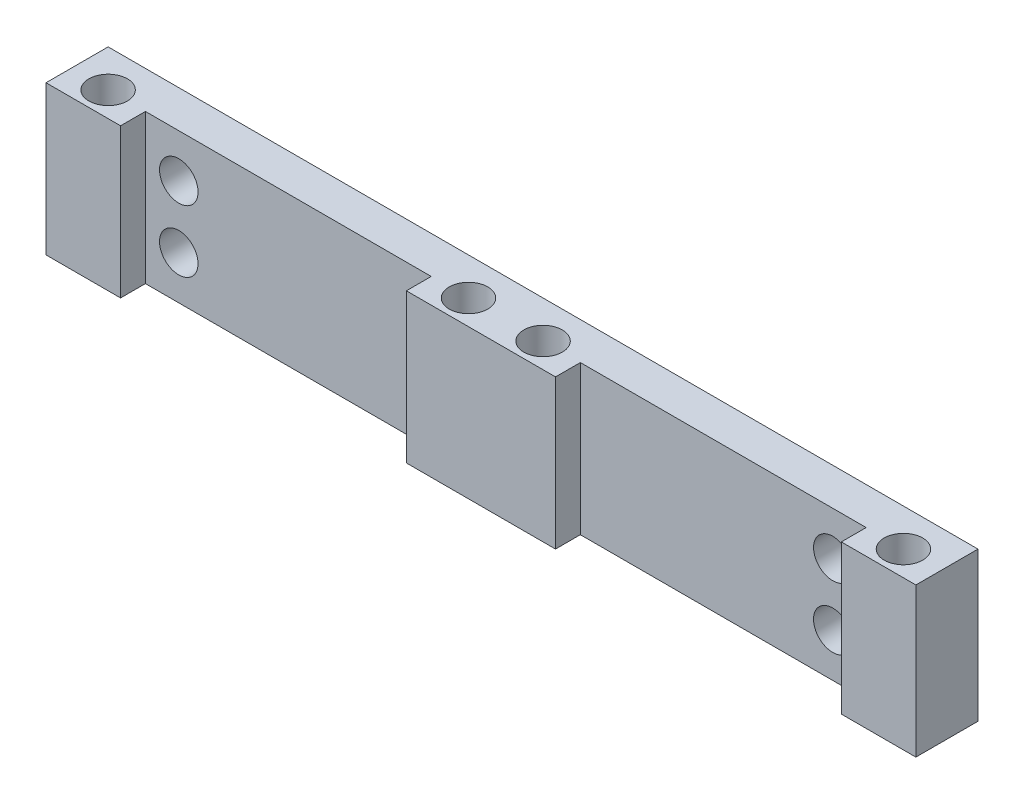
ISO-10303-21;
HEADER;
FILE_DESCRIPTION(('STEP AP214'),'2;1');
FILE_NAME('part.step','',(''),(''),'','','');
FILE_SCHEMA(('AUTOMOTIVE_DESIGN { 1 0 10303 214 1 1 1 1 }'));
ENDSEC;
DATA;
#1=APPLICATION_CONTEXT('core data for automotive mechanical design processes');
#2=APPLICATION_PROTOCOL_DEFINITION('international standard','automotive_design',2000,#1);
#3=PRODUCT_CONTEXT('',#1,'mechanical');
#4=PRODUCT('Part','Part','',(#3));
#5=PRODUCT_RELATED_PRODUCT_CATEGORY('part','',(#4));
#6=PRODUCT_DEFINITION_FORMATION('','',#4);
#7=PRODUCT_DEFINITION_CONTEXT('part definition',#1,'design');
#8=PRODUCT_DEFINITION('design','',#6,#7);
#9=PRODUCT_DEFINITION_SHAPE('','',#8);
#10=(LENGTH_UNIT() NAMED_UNIT(*) SI_UNIT(.MILLI.,.METRE.));
#11=(NAMED_UNIT(*) PLANE_ANGLE_UNIT() SI_UNIT($,.RADIAN.));
#12=(NAMED_UNIT(*) SI_UNIT($,.STERADIAN.) SOLID_ANGLE_UNIT());
#13=UNCERTAINTY_MEASURE_WITH_UNIT(LENGTH_MEASURE(1.E-05),#10,'distance_accuracy_value','');
#14=(GEOMETRIC_REPRESENTATION_CONTEXT(3) GLOBAL_UNCERTAINTY_ASSIGNED_CONTEXT((#13)) GLOBAL_UNIT_ASSIGNED_CONTEXT((#10,
#11,#12)) REPRESENTATION_CONTEXT('',''));
#15=CARTESIAN_POINT('',(0.,0.,0.));
#16=DIRECTION('',(0.,0.,1.));
#17=DIRECTION('',(1.,0.,0.));
#18=AXIS2_PLACEMENT_3D('',#15,#16,#17);
#19=CARTESIAN_POINT('',(0.,0.,0.));
#20=DIRECTION('',(0.,0.,1.));
#21=DIRECTION('',(1.,0.,0.));
#22=AXIS2_PLACEMENT_3D('',#19,#20,#21);
#23=PLANE('',#22);
#24=DIRECTION('',(0.,1.,0.));
#25=VECTOR('',#24,1.);
#26=CARTESIAN_POINT('',(44.,-6.,0.));
#27=LINE('',#26,#25);
#28=CARTESIAN_POINT('',(44.,-6.,0.));
#29=VERTEX_POINT('',#28);
#30=CARTESIAN_POINT('',(44.,6.,0.));
#31=VERTEX_POINT('',#30);
#32=EDGE_CURVE('E331',#29,#31,#27,.T.);
#33=ORIENTED_EDGE('',*,*,#32,.F.);
#34=DIRECTION('',(1.,0.,0.));
#35=VECTOR('',#34,1.);
#36=CARTESIAN_POINT('',(50.,-5.99999999999999,0.));
#37=LINE('',#36,#35);
#38=CARTESIAN_POINT('',(56.,-6.,0.));
#39=VERTEX_POINT('',#38);
#40=EDGE_CURVE('E346',#29,#39,#37,.T.);
#41=ORIENTED_EDGE('',*,*,#40,.T.);
#42=DIRECTION('',(0.,1.,0.));
#43=VECTOR('',#42,1.);
#44=CARTESIAN_POINT('',(56.,-6.,0.));
#45=LINE('',#44,#43);
#46=CARTESIAN_POINT('',(56.,6.,0.));
#47=VERTEX_POINT('',#46);
#48=EDGE_CURVE('E314',#39,#47,#45,.T.);
#49=ORIENTED_EDGE('',*,*,#48,.T.);
#50=DIRECTION('',(-1.,0.,0.));
#51=VECTOR('',#50,1.);
#52=CARTESIAN_POINT('',(50.,6.00000000000001,0.));
#53=LINE('',#52,#51);
#54=EDGE_CURVE('E280',#47,#31,#53,.T.);
#55=ORIENTED_EDGE('',*,*,#54,.T.);
#56=EDGE_LOOP('',(#33,#41,#49,#55));
#57=FACE_BOUND('',#56,.T.);
#58=ADVANCED_FACE('F163',(#57),#23,.T.);
#59=CARTESIAN_POINT('',(15.,0.,0.));
#60=DIRECTION('',(1.,0.,0.));
#61=DIRECTION('',(0.,0.,-1.));
#62=AXIS2_PLACEMENT_3D('',#59,#60,#61);
#63=PLANE('',#62);
#64=DIRECTION('',(0.,-1.,0.));
#65=VECTOR('',#64,1.);
#66=CARTESIAN_POINT('',(15.,2.99982278406222,0.));
#67=LINE('',#66,#65);
#68=CARTESIAN_POINT('',(15.,6.,0.));
#69=VERTEX_POINT('',#68);
#70=CARTESIAN_POINT('',(15.,-6.,0.));
#71=VERTEX_POINT('',#70);
#72=EDGE_CURVE('E336',#69,#71,#67,.T.);
#73=ORIENTED_EDGE('',*,*,#72,.F.);
#74=DIRECTION('',(0.,0.,1.));
#75=VECTOR('',#74,1.);
#76=CARTESIAN_POINT('',(15.,5.99999999999999,-10.));
#77=LINE('',#76,#75);
#78=CARTESIAN_POINT('',(15.,5.99999999999999,-5.));
#79=VERTEX_POINT('',#78);
#80=EDGE_CURVE('E188',#79,#69,#77,.T.);
#81=ORIENTED_EDGE('',*,*,#80,.F.);
#82=DIRECTION('',(0.,1.,0.));
#83=VECTOR('',#82,1.);
#84=CARTESIAN_POINT('',(15.,0.,-5.));
#85=LINE('',#84,#83);
#86=CARTESIAN_POINT('',(15.,-6.,-5.));
#87=VERTEX_POINT('',#86);
#88=EDGE_CURVE('E12',#87,#79,#85,.T.);
#89=ORIENTED_EDGE('',*,*,#88,.F.);
#90=DIRECTION('',(0.,0.,1.));
#91=VECTOR('',#90,1.);
#92=CARTESIAN_POINT('',(15.,-6.,-10.));
#93=LINE('',#92,#91);
#94=EDGE_CURVE('E344',#87,#71,#93,.T.);
#95=ORIENTED_EDGE('',*,*,#94,.T.);
#96=EDGE_LOOP('',(#73,#81,#89,#95));
#97=FACE_BOUND('',#96,.T.);
#98=ADVANCED_FACE('F420',(#97),#63,.F.);
#99=DIRECTION('',(0.,-1.,0.));
#100=VECTOR('',#99,1.);
#101=CARTESIAN_POINT('',(21.,-6.,0.));
#102=LINE('',#101,#100);
#103=CARTESIAN_POINT('',(21.,6.,0.));
#104=VERTEX_POINT('',#103);
#105=CARTESIAN_POINT('',(21.,-6.,0.));
#106=VERTEX_POINT('',#105);
#107=EDGE_CURVE('E325',#104,#106,#102,.T.);
#108=ORIENTED_EDGE('',*,*,#107,.F.);
#109=EDGE_CURVE('E356',#104,#69,#53,.T.);
#110=ORIENTED_EDGE('',*,*,#109,.T.);
#111=ORIENTED_EDGE('',*,*,#72,.T.);
#112=EDGE_CURVE('E353',#71,#106,#37,.T.);
#113=ORIENTED_EDGE('',*,*,#112,.T.);
#114=EDGE_LOOP('',(#108,#110,#111,#113));
#115=FACE_BOUND('',#114,.T.);
#116=ADVANCED_FACE('F419',(#115),#23,.T.);
#117=CARTESIAN_POINT('',(50.,6.00000000000001,-5.));
#118=DIRECTION('',(0.,1.,0.));
#119=DIRECTION('',(-1.,0.,0.));
#120=AXIS2_PLACEMENT_3D('',#117,#118,#119);
#121=PLANE('',#120);
#122=CARTESIAN_POINT('',(18.,6.,-2.));
#123=DIRECTION('',(0.,1.,0.));
#124=DIRECTION('',(-1.,0.,0.));
#125=AXIS2_PLACEMENT_3D('',#122,#123,#124);
#126=CIRCLE('',#125,1.55);
#127=CARTESIAN_POINT('',(16.45,6.,-2.));
#128=VERTEX_POINT('',#127);
#129=EDGE_CURVE('E315',#128,#128,#126,.T.);
#130=ORIENTED_EDGE('',*,*,#129,.F.);
#131=EDGE_LOOP('',(#130));
#132=FACE_BOUND('',#131,.T.);
#133=CARTESIAN_POINT('',(47.,6.00000000000001,-2.));
#134=DIRECTION('',(0.,1.,0.));
#135=DIRECTION('',(-1.,0.,0.));
#136=AXIS2_PLACEMENT_3D('',#133,#134,#135);
#137=CIRCLE('',#136,1.55);
#138=CARTESIAN_POINT('',(45.45,6.00000000000001,-2.));
#139=VERTEX_POINT('',#138);
#140=EDGE_CURVE('E306',#139,#139,#137,.T.);
#141=ORIENTED_EDGE('',*,*,#140,.F.);
#142=EDGE_LOOP('',(#141));
#143=FACE_BOUND('',#142,.T.);
#144=DIRECTION('',(0.,0.,1.));
#145=VECTOR('',#144,1.);
#146=CARTESIAN_POINT('',(44.,6.,-2.));
#147=LINE('',#146,#145);
#148=CARTESIAN_POINT('',(44.,6.,-2.));
#149=VERTEX_POINT('',#148);
#150=EDGE_CURVE('E330',#149,#31,#147,.T.);
#151=ORIENTED_EDGE('',*,*,#150,.T.);
#152=ORIENTED_EDGE('',*,*,#54,.F.);
#153=DIRECTION('',(0.,0.,1.));
#154=VECTOR('',#153,1.);
#155=CARTESIAN_POINT('',(56.,6.,-2.));
#156=LINE('',#155,#154);
#157=CARTESIAN_POINT('',(56.,6.,-2.));
#158=VERTEX_POINT('',#157);
#159=EDGE_CURVE('E260',#158,#47,#156,.T.);
#160=ORIENTED_EDGE('',*,*,#159,.F.);
#161=DIRECTION('',(1.,0.,0.));
#162=VECTOR('',#161,1.);
#163=CARTESIAN_POINT('',(56.,6.,-2.));
#164=LINE('',#163,#162);
#165=CARTESIAN_POINT('',(79.,6.,-2.));
#166=VERTEX_POINT('',#165);
#167=EDGE_CURVE('E267',#158,#166,#164,.T.);
#168=ORIENTED_EDGE('',*,*,#167,.T.);
#169=DIRECTION('',(0.,0.,1.));
#170=VECTOR('',#169,1.);
#171=CARTESIAN_POINT('',(79.,6.,-2.));
#172=LINE('',#171,#170);
#173=CARTESIAN_POINT('',(79.,6.,0.));
#174=VERTEX_POINT('',#173);
#175=EDGE_CURVE('E281',#166,#174,#172,.T.);
#176=ORIENTED_EDGE('',*,*,#175,.T.);
#177=DIRECTION('',(1.,0.,0.));
#178=VECTOR('',#177,1.);
#179=CARTESIAN_POINT('',(50.,6.00000000000001,0.));
#180=LINE('',#179,#178);
#181=CARTESIAN_POINT('',(85.,6.,0.));
#182=VERTEX_POINT('',#181);
#183=EDGE_CURVE('E301',#174,#182,#180,.T.);
#184=ORIENTED_EDGE('',*,*,#183,.T.);
#185=DIRECTION('',(0.,0.,1.));
#186=VECTOR('',#185,1.);
#187=CARTESIAN_POINT('',(85.,5.99999999999999,-10.));
#188=LINE('',#187,#186);
#189=CARTESIAN_POINT('',(85.,5.99999999999999,-5.));
#190=VERTEX_POINT('',#189);
#191=EDGE_CURVE('E293',#190,#182,#188,.T.);
#192=ORIENTED_EDGE('',*,*,#191,.F.);
#193=DIRECTION('',(-1.,0.,0.));
#194=VECTOR('',#193,1.);
#195=CARTESIAN_POINT('',(50.,6.00000000000001,-5.));
#196=LINE('',#195,#194);
#197=EDGE_CURVE('E172',#190,#79,#196,.T.);
#198=ORIENTED_EDGE('',*,*,#197,.T.);
#199=ORIENTED_EDGE('',*,*,#80,.T.);
#200=ORIENTED_EDGE('',*,*,#109,.F.);
#201=DIRECTION('',(0.,0.,1.));
#202=VECTOR('',#201,1.);
#203=CARTESIAN_POINT('',(21.,6.,-2.));
#204=LINE('',#203,#202);
#205=CARTESIAN_POINT('',(21.,6.,-2.));
#206=VERTEX_POINT('',#205);
#207=EDGE_CURVE('E340',#206,#104,#204,.T.);
#208=ORIENTED_EDGE('',*,*,#207,.F.);
#209=DIRECTION('',(-1.,0.,0.));
#210=VECTOR('',#209,1.);
#211=CARTESIAN_POINT('',(44.,6.,-2.));
#212=LINE('',#211,#210);
#213=EDGE_CURVE('E324',#149,#206,#212,.T.);
#214=ORIENTED_EDGE('',*,*,#213,.F.);
#215=EDGE_LOOP('',(#151,#152,#160,#168,#176,#184,#192,#198,#199,#200,#208,#214));
#216=FACE_BOUND('',#215,.T.);
#217=CARTESIAN_POINT('',(82.,6.,-2.));
#218=DIRECTION('',(0.,-1.,0.));
#219=DIRECTION('',(1.,0.,0.));
#220=AXIS2_PLACEMENT_3D('',#217,#218,#219);
#221=CIRCLE('',#220,1.55);
#222=CARTESIAN_POINT('',(83.55,6.,-2.));
#223=VERTEX_POINT('',#222);
#224=EDGE_CURVE('E311',#223,#223,#221,.T.);
#225=ORIENTED_EDGE('',*,*,#224,.T.);
#226=EDGE_LOOP('',(#225));
#227=FACE_BOUND('',#226,.T.);
#228=CARTESIAN_POINT('',(53.,6.00000000000001,-2.));
#229=DIRECTION('',(0.,-1.,0.));
#230=DIRECTION('',(1.,0.,0.));
#231=AXIS2_PLACEMENT_3D('',#228,#229,#230);
#232=CIRCLE('',#231,1.55);
#233=CARTESIAN_POINT('',(54.55,6.00000000000001,-2.));
#234=VERTEX_POINT('',#233);
#235=EDGE_CURVE('E386',#234,#234,#232,.T.);
#236=ORIENTED_EDGE('',*,*,#235,.T.);
#237=EDGE_LOOP('',(#236));
#238=FACE_BOUND('',#237,.T.);
#239=ADVANCED_FACE('F277',(#132,#143,#216,#227,#238),#121,.T.);
#240=CARTESIAN_POINT('',(50.,-5.99999999999999,-5.));
#241=DIRECTION('',(0.,-1.,0.));
#242=DIRECTION('',(1.,0.,0.));
#243=AXIS2_PLACEMENT_3D('',#240,#241,#242);
#244=PLANE('',#243);
#245=CARTESIAN_POINT('',(18.,-6.,-2.));
#246=DIRECTION('',(0.,-1.,0.));
#247=DIRECTION('',(1.,0.,0.));
#248=AXIS2_PLACEMENT_3D('',#245,#246,#247);
#249=CIRCLE('',#248,1.55);
#250=CARTESIAN_POINT('',(19.55,-6.,-2.));
#251=VERTEX_POINT('',#250);
#252=EDGE_CURVE('E167',#251,#251,#249,.T.);
#253=ORIENTED_EDGE('',*,*,#252,.F.);
#254=EDGE_LOOP('',(#253));
#255=FACE_BOUND('',#254,.T.);
#256=CARTESIAN_POINT('',(47.,-5.99999999999999,-2.));
#257=DIRECTION('',(0.,-1.,0.));
#258=DIRECTION('',(1.,0.,0.));
#259=AXIS2_PLACEMENT_3D('',#256,#257,#258);
#260=CIRCLE('',#259,1.55);
#261=CARTESIAN_POINT('',(48.55,-5.99999999999999,-2.));
#262=VERTEX_POINT('',#261);
#263=EDGE_CURVE('E318',#262,#262,#260,.T.);
#264=ORIENTED_EDGE('',*,*,#263,.F.);
#265=EDGE_LOOP('',(#264));
#266=FACE_BOUND('',#265,.T.);
#267=DIRECTION('',(0.,0.,1.));
#268=VECTOR('',#267,1.);
#269=CARTESIAN_POINT('',(44.,-6.,-2.));
#270=LINE('',#269,#268);
#271=CARTESIAN_POINT('',(44.,-6.,-2.));
#272=VERTEX_POINT('',#271);
#273=EDGE_CURVE('E334',#272,#29,#270,.T.);
#274=ORIENTED_EDGE('',*,*,#273,.F.);
#275=DIRECTION('',(1.,0.,0.));
#276=VECTOR('',#275,1.);
#277=CARTESIAN_POINT('',(44.,-6.,-2.));
#278=LINE('',#277,#276);
#279=CARTESIAN_POINT('',(21.,-6.,-2.));
#280=VERTEX_POINT('',#279);
#281=EDGE_CURVE('E328',#280,#272,#278,.T.);
#282=ORIENTED_EDGE('',*,*,#281,.F.);
#283=DIRECTION('',(0.,0.,1.));
#284=VECTOR('',#283,1.);
#285=CARTESIAN_POINT('',(21.,-6.,-2.));
#286=LINE('',#285,#284);
#287=EDGE_CURVE('E337',#280,#106,#286,.T.);
#288=ORIENTED_EDGE('',*,*,#287,.T.);
#289=ORIENTED_EDGE('',*,*,#112,.F.);
#290=ORIENTED_EDGE('',*,*,#94,.F.);
#291=DIRECTION('',(1.,0.,0.));
#292=VECTOR('',#291,1.);
#293=CARTESIAN_POINT('',(50.,-5.99999999999999,-5.));
#294=LINE('',#293,#292);
#295=CARTESIAN_POINT('',(85.,-6.,-5.));
#296=VERTEX_POINT('',#295);
#297=EDGE_CURVE('E349',#87,#296,#294,.T.);
#298=ORIENTED_EDGE('',*,*,#297,.T.);
#299=DIRECTION('',(0.,0.,1.));
#300=VECTOR('',#299,1.);
#301=CARTESIAN_POINT('',(85.,-6.,-10.));
#302=LINE('',#301,#300);
#303=CARTESIAN_POINT('',(85.,-6.,0.));
#304=VERTEX_POINT('',#303);
#305=EDGE_CURVE('E292',#296,#304,#302,.T.);
#306=ORIENTED_EDGE('',*,*,#305,.T.);
#307=DIRECTION('',(-1.,0.,0.));
#308=VECTOR('',#307,1.);
#309=CARTESIAN_POINT('',(50.,-5.99999999999999,0.));
#310=LINE('',#309,#308);
#311=CARTESIAN_POINT('',(79.,-6.,0.));
#312=VERTEX_POINT('',#311);
#313=EDGE_CURVE('E296',#304,#312,#310,.T.);
#314=ORIENTED_EDGE('',*,*,#313,.T.);
#315=DIRECTION('',(0.,0.,1.));
#316=VECTOR('',#315,1.);
#317=CARTESIAN_POINT('',(79.,-6.,-2.));
#318=LINE('',#317,#316);
#319=CARTESIAN_POINT('',(79.,-6.,-2.));
#320=VERTEX_POINT('',#319);
#321=EDGE_CURVE('E284',#320,#312,#318,.T.);
#322=ORIENTED_EDGE('',*,*,#321,.F.);
#323=DIRECTION('',(-1.,0.,0.));
#324=VECTOR('',#323,1.);
#325=CARTESIAN_POINT('',(56.,-6.,-2.));
#326=LINE('',#325,#324);
#327=CARTESIAN_POINT('',(56.,-6.,-2.));
#328=VERTEX_POINT('',#327);
#329=EDGE_CURVE('E282',#320,#328,#326,.T.);
#330=ORIENTED_EDGE('',*,*,#329,.T.);
#331=DIRECTION('',(0.,0.,1.));
#332=VECTOR('',#331,1.);
#333=CARTESIAN_POINT('',(56.,-6.,-2.));
#334=LINE('',#333,#332);
#335=EDGE_CURVE('E263',#328,#39,#334,.T.);
#336=ORIENTED_EDGE('',*,*,#335,.T.);
#337=ORIENTED_EDGE('',*,*,#40,.F.);
#338=EDGE_LOOP('',(#274,#282,#288,#289,#290,#298,#306,#314,#322,#330,#336,#337));
#339=FACE_BOUND('',#338,.T.);
#340=CARTESIAN_POINT('',(82.,-6.,-2.));
#341=DIRECTION('',(0.,1.,0.));
#342=DIRECTION('',(-1.,0.,0.));
#343=AXIS2_PLACEMENT_3D('',#340,#341,#342);
#344=CIRCLE('',#343,1.55);
#345=CARTESIAN_POINT('',(80.45,-6.,-2.));
#346=VERTEX_POINT('',#345);
#347=EDGE_CURVE('E310',#346,#346,#344,.T.);
#348=ORIENTED_EDGE('',*,*,#347,.T.);
#349=EDGE_LOOP('',(#348));
#350=FACE_BOUND('',#349,.T.);
#351=CARTESIAN_POINT('',(53.,-5.99999999999999,-2.));
#352=DIRECTION('',(0.,1.,0.));
#353=DIRECTION('',(-1.,0.,0.));
#354=AXIS2_PLACEMENT_3D('',#351,#352,#353);
#355=CIRCLE('',#354,1.55);
#356=CARTESIAN_POINT('',(51.45,-5.99999999999999,-2.));
#357=VERTEX_POINT('',#356);
#358=EDGE_CURVE('E307',#357,#357,#355,.T.);
#359=ORIENTED_EDGE('',*,*,#358,.T.);
#360=EDGE_LOOP('',(#359));
#361=FACE_BOUND('',#360,.T.);
#362=ADVANCED_FACE('F165',(#255,#266,#339,#350,#361),#244,.T.);
#363=CARTESIAN_POINT('',(0.,0.,-5.));
#364=DIRECTION('',(0.,0.,1.));
#365=DIRECTION('',(1.,0.,0.));
#366=AXIS2_PLACEMENT_3D('',#363,#364,#365);
#367=PLANE('',#366);
#368=CARTESIAN_POINT('',(76.315,2.50000000000019,-5.));
#369=DIRECTION('',(0.,0.,1.));
#370=DIRECTION('',(1.,0.,0.));
#371=AXIS2_PLACEMENT_3D('',#368,#369,#370);
#372=CIRCLE('',#371,1.55);
#373=CARTESIAN_POINT('',(77.865,2.50000000000019,-5.));
#374=VERTEX_POINT('',#373);
#375=EDGE_CURVE('E514',#374,#374,#372,.T.);
#376=ORIENTED_EDGE('',*,*,#375,.T.);
#377=EDGE_LOOP('',(#376));
#378=FACE_BOUND('',#377,.T.);
#379=CARTESIAN_POINT('',(76.3150000000001,-2.49999999999981,-5.));
#380=DIRECTION('',(0.,0.,1.));
#381=DIRECTION('',(1.,0.,0.));
#382=AXIS2_PLACEMENT_3D('',#379,#380,#381);
#383=CIRCLE('',#382,1.54999999999999);
#384=CARTESIAN_POINT('',(77.8650000000001,-2.49999999999981,-5.));
#385=VERTEX_POINT('',#384);
#386=EDGE_CURVE('E517',#385,#385,#383,.T.);
#387=ORIENTED_EDGE('',*,*,#386,.T.);
#388=EDGE_LOOP('',(#387));
#389=FACE_BOUND('',#388,.T.);
#390=CARTESIAN_POINT('',(23.685,-2.5,-5.));
#391=DIRECTION('',(0.,0.,1.));
#392=DIRECTION('',(1.,0.,0.));
#393=AXIS2_PLACEMENT_3D('',#390,#391,#392);
#394=CIRCLE('',#393,1.55);
#395=CARTESIAN_POINT('',(25.235,-2.5,-5.));
#396=VERTEX_POINT('',#395);
#397=EDGE_CURVE('E388',#396,#396,#394,.T.);
#398=ORIENTED_EDGE('',*,*,#397,.T.);
#399=EDGE_LOOP('',(#398));
#400=FACE_BOUND('',#399,.T.);
#401=CARTESIAN_POINT('',(23.685,2.5,-5.));
#402=DIRECTION('',(0.,0.,1.));
#403=DIRECTION('',(1.,0.,0.));
#404=AXIS2_PLACEMENT_3D('',#401,#402,#403);
#405=CIRCLE('',#404,1.55);
#406=CARTESIAN_POINT('',(25.235,2.5,-5.));
#407=VERTEX_POINT('',#406);
#408=EDGE_CURVE('E393',#407,#407,#405,.T.);
#409=ORIENTED_EDGE('',*,*,#408,.T.);
#410=EDGE_LOOP('',(#409));
#411=FACE_BOUND('',#410,.T.);
#412=ORIENTED_EDGE('',*,*,#297,.F.);
#413=ORIENTED_EDGE('',*,*,#88,.T.);
#414=ORIENTED_EDGE('',*,*,#197,.F.);
#415=DIRECTION('',(0.,1.,0.));
#416=VECTOR('',#415,1.);
#417=CARTESIAN_POINT('',(85.,0.,-5.));
#418=LINE('',#417,#416);
#419=EDGE_CURVE('E303',#296,#190,#418,.T.);
#420=ORIENTED_EDGE('',*,*,#419,.F.);
#421=EDGE_LOOP('',(#412,#413,#414,#420));
#422=FACE_BOUND('',#421,.T.);
#423=ADVANCED_FACE('F368',(#378,#389,#400,#411,#422),#367,.F.);
#424=CARTESIAN_POINT('',(0.,0.,-2.));
#425=DIRECTION('',(0.,0.,1.));
#426=DIRECTION('',(1.,0.,0.));
#427=AXIS2_PLACEMENT_3D('',#424,#425,#426);
#428=PLANE('',#427);
#429=CARTESIAN_POINT('',(23.685,-2.5,-2.));
#430=DIRECTION('',(0.,0.,1.));
#431=DIRECTION('',(1.,0.,0.));
#432=AXIS2_PLACEMENT_3D('',#429,#430,#431);
#433=CIRCLE('',#432,1.55);
#434=CARTESIAN_POINT('',(25.235,-2.5,-2.));
#435=VERTEX_POINT('',#434);
#436=EDGE_CURVE('E505',#435,#435,#433,.T.);
#437=ORIENTED_EDGE('',*,*,#436,.F.);
#438=EDGE_LOOP('',(#437));
#439=FACE_BOUND('',#438,.T.);
#440=CARTESIAN_POINT('',(23.685,2.5,-2.));
#441=DIRECTION('',(0.,0.,1.));
#442=DIRECTION('',(1.,0.,0.));
#443=AXIS2_PLACEMENT_3D('',#440,#441,#442);
#444=CIRCLE('',#443,1.55);
#445=CARTESIAN_POINT('',(25.235,2.5,-2.));
#446=VERTEX_POINT('',#445);
#447=EDGE_CURVE('E522',#446,#446,#444,.T.);
#448=ORIENTED_EDGE('',*,*,#447,.F.);
#449=EDGE_LOOP('',(#448));
#450=FACE_BOUND('',#449,.T.);
#451=DIRECTION('',(0.,1.,0.));
#452=VECTOR('',#451,1.);
#453=CARTESIAN_POINT('',(44.,-6.,-2.));
#454=LINE('',#453,#452);
#455=EDGE_CURVE('E321',#272,#149,#454,.T.);
#456=ORIENTED_EDGE('',*,*,#455,.T.);
#457=ORIENTED_EDGE('',*,*,#213,.T.);
#458=DIRECTION('',(0.,-1.,0.));
#459=VECTOR('',#458,1.);
#460=CARTESIAN_POINT('',(21.,-6.,-2.));
#461=LINE('',#460,#459);
#462=EDGE_CURVE('E180',#206,#280,#461,.T.);
#463=ORIENTED_EDGE('',*,*,#462,.T.);
#464=ORIENTED_EDGE('',*,*,#281,.T.);
#465=EDGE_LOOP('',(#456,#457,#463,#464));
#466=FACE_BOUND('',#465,.T.);
#467=ADVANCED_FACE('F425',(#439,#450,#466),#428,.T.);
#468=CARTESIAN_POINT('',(44.,-6.,-2.));
#469=DIRECTION('',(1.,0.,0.));
#470=DIRECTION('',(0.,0.,-1.));
#471=AXIS2_PLACEMENT_3D('',#468,#469,#470);
#472=PLANE('',#471);
#473=ORIENTED_EDGE('',*,*,#32,.T.);
#474=ORIENTED_EDGE('',*,*,#150,.F.);
#475=ORIENTED_EDGE('',*,*,#455,.F.);
#476=ORIENTED_EDGE('',*,*,#273,.T.);
#477=EDGE_LOOP('',(#473,#474,#475,#476));
#478=FACE_BOUND('',#477,.T.);
#479=ADVANCED_FACE('F429',(#478),#472,.F.);
#480=CARTESIAN_POINT('',(21.,-6.,-2.));
#481=DIRECTION('',(-1.,0.,0.));
#482=DIRECTION('',(0.,0.,1.));
#483=AXIS2_PLACEMENT_3D('',#480,#481,#482);
#484=PLANE('',#483);
#485=ORIENTED_EDGE('',*,*,#107,.T.);
#486=ORIENTED_EDGE('',*,*,#287,.F.);
#487=ORIENTED_EDGE('',*,*,#462,.F.);
#488=ORIENTED_EDGE('',*,*,#207,.T.);
#489=EDGE_LOOP('',(#485,#486,#487,#488));
#490=FACE_BOUND('',#489,.T.);
#491=ADVANCED_FACE('F424',(#490),#484,.F.);
#492=CARTESIAN_POINT('',(47.,-11.,-2.));
#493=DIRECTION('',(0.,1.,0.));
#494=DIRECTION('',(-1.,0.,0.));
#495=AXIS2_PLACEMENT_3D('',#492,#493,#494);
#496=CYLINDRICAL_SURFACE('',#495,1.55);
#497=ORIENTED_EDGE('',*,*,#263,.T.);
#498=EDGE_LOOP('',(#497));
#499=FACE_BOUND('',#498,.T.);
#500=ORIENTED_EDGE('',*,*,#140,.T.);
#501=EDGE_LOOP('',(#500));
#502=FACE_BOUND('',#501,.T.);
#503=ADVANCED_FACE('F437',(#499,#502),#496,.F.);
#504=CARTESIAN_POINT('',(18.,-11.,-2.));
#505=DIRECTION('',(0.,1.,0.));
#506=DIRECTION('',(-1.,0.,0.));
#507=AXIS2_PLACEMENT_3D('',#504,#505,#506);
#508=CYLINDRICAL_SURFACE('',#507,1.55);
#509=ORIENTED_EDGE('',*,*,#252,.T.);
#510=EDGE_LOOP('',(#509));
#511=FACE_BOUND('',#510,.T.);
#512=ORIENTED_EDGE('',*,*,#129,.T.);
#513=EDGE_LOOP('',(#512));
#514=FACE_BOUND('',#513,.T.);
#515=ADVANCED_FACE('F363',(#511,#514),#508,.F.);
#516=CARTESIAN_POINT('',(85.,0.,0.));
#517=DIRECTION('',(-1.,0.,0.));
#518=DIRECTION('',(0.,0.,-1.));
#519=AXIS2_PLACEMENT_3D('',#516,#517,#518);
#520=PLANE('',#519);
#521=DIRECTION('',(0.,-1.,0.));
#522=VECTOR('',#521,1.);
#523=CARTESIAN_POINT('',(85.,2.99982278406222,0.));
#524=LINE('',#523,#522);
#525=EDGE_CURVE('E289',#182,#304,#524,.T.);
#526=ORIENTED_EDGE('',*,*,#525,.T.);
#527=ORIENTED_EDGE('',*,*,#305,.F.);
#528=ORIENTED_EDGE('',*,*,#419,.T.);
#529=ORIENTED_EDGE('',*,*,#191,.T.);
#530=EDGE_LOOP('',(#526,#527,#528,#529));
#531=FACE_BOUND('',#530,.T.);
#532=ADVANCED_FACE('F410',(#531),#520,.F.);
#533=CARTESIAN_POINT('',(100.,0.,0.));
#534=DIRECTION('',(0.,0.,1.));
#535=DIRECTION('',(-1.,0.,0.));
#536=AXIS2_PLACEMENT_3D('',#533,#534,#535);
#537=PLANE('',#536);
#538=DIRECTION('',(0.,-1.,0.));
#539=VECTOR('',#538,1.);
#540=CARTESIAN_POINT('',(79.,-6.,0.));
#541=LINE('',#540,#539);
#542=EDGE_CURVE('E268',#174,#312,#541,.T.);
#543=ORIENTED_EDGE('',*,*,#542,.T.);
#544=ORIENTED_EDGE('',*,*,#313,.F.);
#545=ORIENTED_EDGE('',*,*,#525,.F.);
#546=ORIENTED_EDGE('',*,*,#183,.F.);
#547=EDGE_LOOP('',(#543,#544,#545,#546));
#548=FACE_BOUND('',#547,.T.);
#549=ADVANCED_FACE('F407',(#548),#537,.T.);
#550=CARTESIAN_POINT('',(100.,0.,-2.));
#551=DIRECTION('',(0.,0.,1.));
#552=DIRECTION('',(-1.,0.,0.));
#553=AXIS2_PLACEMENT_3D('',#550,#551,#552);
#554=PLANE('',#553);
#555=CARTESIAN_POINT('',(76.315,2.50000000000019,-2.));
#556=DIRECTION('',(0.,0.,1.));
#557=DIRECTION('',(-1.,0.,0.));
#558=AXIS2_PLACEMENT_3D('',#555,#556,#557);
#559=CIRCLE('',#558,1.55);
#560=CARTESIAN_POINT('',(74.765,2.50000000000019,-2.));
#561=VERTEX_POINT('',#560);
#562=EDGE_CURVE('E525',#561,#561,#559,.T.);
#563=ORIENTED_EDGE('',*,*,#562,.F.);
#564=EDGE_LOOP('',(#563));
#565=FACE_BOUND('',#564,.T.);
#566=CARTESIAN_POINT('',(76.3150000000001,-2.49999999999981,-2.));
#567=DIRECTION('',(0.,0.,1.));
#568=DIRECTION('',(-1.,0.,0.));
#569=AXIS2_PLACEMENT_3D('',#566,#567,#568);
#570=CIRCLE('',#569,1.54999999999999);
#571=CARTESIAN_POINT('',(74.7650000000001,-2.49999999999981,-2.));
#572=VERTEX_POINT('',#571);
#573=EDGE_CURVE('E528',#572,#572,#570,.T.);
#574=ORIENTED_EDGE('',*,*,#573,.F.);
#575=EDGE_LOOP('',(#574));
#576=FACE_BOUND('',#575,.T.);
#577=DIRECTION('',(0.,1.,0.));
#578=VECTOR('',#577,1.);
#579=CARTESIAN_POINT('',(56.,-6.,-2.));
#580=LINE('',#579,#578);
#581=EDGE_CURVE('E255',#328,#158,#580,.T.);
#582=ORIENTED_EDGE('',*,*,#581,.F.);
#583=ORIENTED_EDGE('',*,*,#329,.F.);
#584=DIRECTION('',(0.,-1.,0.));
#585=VECTOR('',#584,1.);
#586=CARTESIAN_POINT('',(79.,-6.,-2.));
#587=LINE('',#586,#585);
#588=EDGE_CURVE('E272',#166,#320,#587,.T.);
#589=ORIENTED_EDGE('',*,*,#588,.F.);
#590=ORIENTED_EDGE('',*,*,#167,.F.);
#591=EDGE_LOOP('',(#582,#583,#589,#590));
#592=FACE_BOUND('',#591,.T.);
#593=ADVANCED_FACE('F271',(#565,#576,#592),#554,.T.);
#594=CARTESIAN_POINT('',(56.,-6.,-2.));
#595=DIRECTION('',(-1.,0.,0.));
#596=DIRECTION('',(0.,0.,-1.));
#597=AXIS2_PLACEMENT_3D('',#594,#595,#596);
#598=PLANE('',#597);
#599=ORIENTED_EDGE('',*,*,#48,.F.);
#600=ORIENTED_EDGE('',*,*,#335,.F.);
#601=ORIENTED_EDGE('',*,*,#581,.T.);
#602=ORIENTED_EDGE('',*,*,#159,.T.);
#603=EDGE_LOOP('',(#599,#600,#601,#602));
#604=FACE_BOUND('',#603,.T.);
#605=ADVANCED_FACE('F258',(#604),#598,.F.);
#606=CARTESIAN_POINT('',(79.,-6.,-2.));
#607=DIRECTION('',(1.,0.,0.));
#608=DIRECTION('',(0.,0.,1.));
#609=AXIS2_PLACEMENT_3D('',#606,#607,#608);
#610=PLANE('',#609);
#611=ORIENTED_EDGE('',*,*,#542,.F.);
#612=ORIENTED_EDGE('',*,*,#175,.F.);
#613=ORIENTED_EDGE('',*,*,#588,.T.);
#614=ORIENTED_EDGE('',*,*,#321,.T.);
#615=EDGE_LOOP('',(#611,#612,#613,#614));
#616=FACE_BOUND('',#615,.T.);
#617=ADVANCED_FACE('F382',(#616),#610,.F.);
#618=CARTESIAN_POINT('',(53.,-11.,-2.));
#619=DIRECTION('',(0.,1.,0.));
#620=DIRECTION('',(1.,0.,0.));
#621=AXIS2_PLACEMENT_3D('',#618,#619,#620);
#622=CYLINDRICAL_SURFACE('',#621,1.55);
#623=ORIENTED_EDGE('',*,*,#358,.F.);
#624=EDGE_LOOP('',(#623));
#625=FACE_BOUND('',#624,.T.);
#626=ORIENTED_EDGE('',*,*,#235,.F.);
#627=EDGE_LOOP('',(#626));
#628=FACE_BOUND('',#627,.T.);
#629=ADVANCED_FACE('F378',(#625,#628),#622,.F.);
#630=CARTESIAN_POINT('',(82.,-11.,-2.));
#631=DIRECTION('',(0.,1.,0.));
#632=DIRECTION('',(1.,0.,0.));
#633=AXIS2_PLACEMENT_3D('',#630,#631,#632);
#634=CYLINDRICAL_SURFACE('',#633,1.55);
#635=ORIENTED_EDGE('',*,*,#347,.F.);
#636=EDGE_LOOP('',(#635));
#637=FACE_BOUND('',#636,.T.);
#638=ORIENTED_EDGE('',*,*,#224,.F.);
#639=EDGE_LOOP('',(#638));
#640=FACE_BOUND('',#639,.T.);
#641=ADVANCED_FACE('F381',(#637,#640),#634,.F.);
#642=CARTESIAN_POINT('',(76.3150000000001,-2.49999999999981,-13.));
#643=DIRECTION('',(0.,0.,1.));
#644=DIRECTION('',(1.,0.,0.));
#645=AXIS2_PLACEMENT_3D('',#642,#643,#644);
#646=CYLINDRICAL_SURFACE('',#645,1.54999999999999);
#647=ORIENTED_EDGE('',*,*,#573,.T.);
#648=EDGE_LOOP('',(#647));
#649=FACE_BOUND('',#648,.T.);
#650=ORIENTED_EDGE('',*,*,#386,.F.);
#651=EDGE_LOOP('',(#650));
#652=FACE_BOUND('',#651,.T.);
#653=ADVANCED_FACE('F484',(#649,#652),#646,.F.);
#654=CARTESIAN_POINT('',(76.315,2.50000000000019,-13.));
#655=DIRECTION('',(0.,0.,1.));
#656=DIRECTION('',(1.,0.,0.));
#657=AXIS2_PLACEMENT_3D('',#654,#655,#656);
#658=CYLINDRICAL_SURFACE('',#657,1.55);
#659=ORIENTED_EDGE('',*,*,#562,.T.);
#660=EDGE_LOOP('',(#659));
#661=FACE_BOUND('',#660,.T.);
#662=ORIENTED_EDGE('',*,*,#375,.F.);
#663=EDGE_LOOP('',(#662));
#664=FACE_BOUND('',#663,.T.);
#665=ADVANCED_FACE('F490',(#661,#664),#658,.F.);
#666=CARTESIAN_POINT('',(23.685,2.5,-13.));
#667=DIRECTION('',(0.,0.,1.));
#668=DIRECTION('',(1.,0.,0.));
#669=AXIS2_PLACEMENT_3D('',#666,#667,#668);
#670=CYLINDRICAL_SURFACE('',#669,1.55);
#671=ORIENTED_EDGE('',*,*,#447,.T.);
#672=EDGE_LOOP('',(#671));
#673=FACE_BOUND('',#672,.T.);
#674=ORIENTED_EDGE('',*,*,#408,.F.);
#675=EDGE_LOOP('',(#674));
#676=FACE_BOUND('',#675,.T.);
#677=ADVANCED_FACE('F486',(#673,#676),#670,.F.);
#678=CARTESIAN_POINT('',(23.685,-2.5,-13.));
#679=DIRECTION('',(0.,0.,1.));
#680=DIRECTION('',(1.,0.,0.));
#681=AXIS2_PLACEMENT_3D('',#678,#679,#680);
#682=CYLINDRICAL_SURFACE('',#681,1.55);
#683=ORIENTED_EDGE('',*,*,#436,.T.);
#684=EDGE_LOOP('',(#683));
#685=FACE_BOUND('',#684,.T.);
#686=ORIENTED_EDGE('',*,*,#397,.F.);
#687=EDGE_LOOP('',(#686));
#688=FACE_BOUND('',#687,.T.);
#689=ADVANCED_FACE('F489',(#685,#688),#682,.F.);
#690=CLOSED_SHELL('',(#58,#98,#116,#239,#362,#423,#467,#479,#491,#503,#515,#532,#549,#593,#605,
#617,#629,#641,#653,#665,#677,#689));
#691=MANIFOLD_SOLID_BREP('B2',#690);
#692=ADVANCED_BREP_SHAPE_REPRESENTATION('',(#18,#691),#14);
#693=SHAPE_DEFINITION_REPRESENTATION(#9,#692);
ENDSEC;
END-ISO-10303-21;
